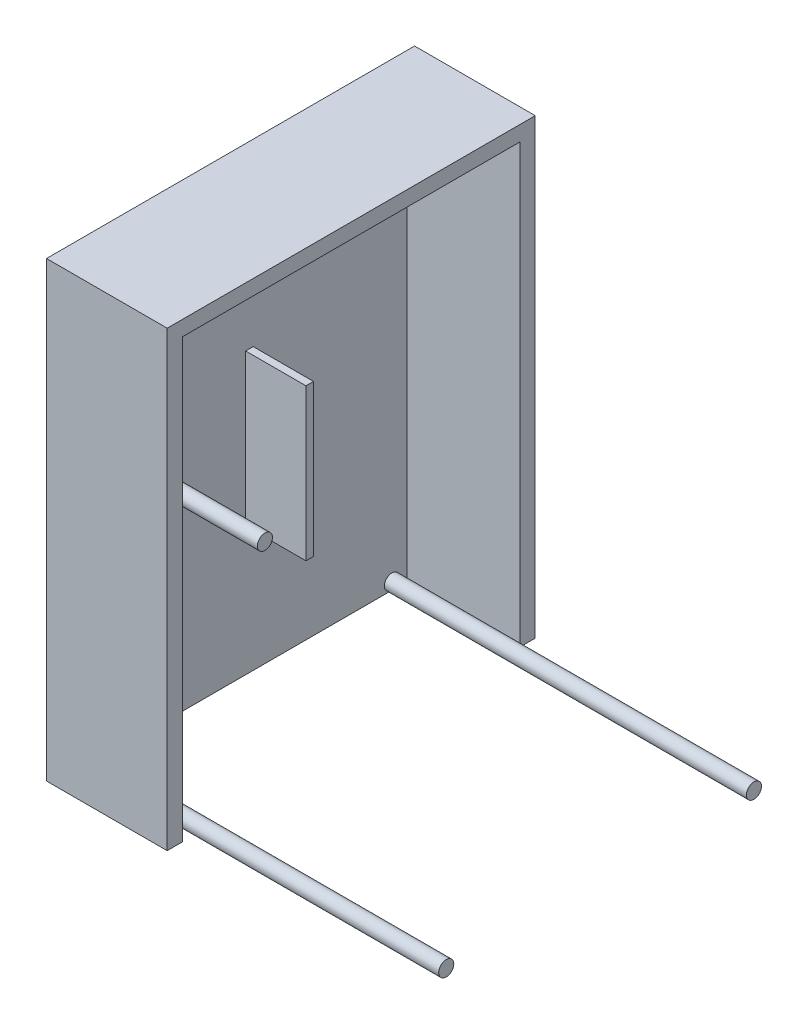
ISO-10303-21;
HEADER;
FILE_DESCRIPTION(('STEP AP214'),'2;1');
FILE_NAME('part.step','',(''),(''),'','','');
FILE_SCHEMA(('AUTOMOTIVE_DESIGN { 1 0 10303 214 1 1 1 1 }'));
ENDSEC;
DATA;
#1=APPLICATION_CONTEXT('core data for automotive mechanical design processes');
#2=APPLICATION_PROTOCOL_DEFINITION('international standard','automotive_design',2000,#1);
#3=PRODUCT_CONTEXT('',#1,'mechanical');
#4=PRODUCT('Part','Part','',(#3));
#5=PRODUCT_RELATED_PRODUCT_CATEGORY('part','',(#4));
#6=PRODUCT_DEFINITION_FORMATION('','',#4);
#7=PRODUCT_DEFINITION_CONTEXT('part definition',#1,'design');
#8=PRODUCT_DEFINITION('design','',#6,#7);
#9=PRODUCT_DEFINITION_SHAPE('','',#8);
#10=(LENGTH_UNIT() NAMED_UNIT(*) SI_UNIT(.MILLI.,.METRE.));
#11=(NAMED_UNIT(*) PLANE_ANGLE_UNIT() SI_UNIT($,.RADIAN.));
#12=(NAMED_UNIT(*) SI_UNIT($,.STERADIAN.) SOLID_ANGLE_UNIT());
#13=UNCERTAINTY_MEASURE_WITH_UNIT(LENGTH_MEASURE(1.E-05),#10,'distance_accuracy_value','');
#14=(GEOMETRIC_REPRESENTATION_CONTEXT(3) GLOBAL_UNCERTAINTY_ASSIGNED_CONTEXT((#13)) GLOBAL_UNIT_ASSIGNED_CONTEXT((#10,
#11,#12)) REPRESENTATION_CONTEXT('',''));
#15=CARTESIAN_POINT('',(0.,0.,0.));
#16=DIRECTION('',(0.,0.,1.));
#17=DIRECTION('',(1.,0.,0.));
#18=AXIS2_PLACEMENT_3D('',#15,#16,#17);
#19=CARTESIAN_POINT('',(3.175,0.,0.));
#20=DIRECTION('',(1.,0.,0.));
#21=DIRECTION('',(0.,0.,-1.));
#22=AXIS2_PLACEMENT_3D('',#19,#20,#21);
#23=PLANE('',#22);
#24=CARTESIAN_POINT('',(3.175,-4.63519323671498,36.8452755845411));
#25=DIRECTION('',(1.,0.,0.));
#26=DIRECTION('',(0.,0.,-1.));
#27=AXIS2_PLACEMENT_3D('',#24,#25,#26);
#28=CIRCLE('',#27,3.175);
#29=CARTESIAN_POINT('',(3.175,-4.63519323671498,33.6702755845411));
#30=VERTEX_POINT('',#29);
#31=EDGE_CURVE('E154',#30,#30,#28,.T.);
#32=ORIENTED_EDGE('',*,*,#31,.F.);
#33=EDGE_LOOP('',(#32));
#34=FACE_BOUND('',#33,.T.);
#35=DIRECTION('',(0.,0.,-1.));
#36=VECTOR('',#35,1.);
#37=CARTESIAN_POINT('',(3.175,-96.710193236715,0.));
#38=LINE('',#37,#36);
#39=CARTESIAN_POINT('',(3.17500000000001,-96.710193236715,65.2914975845411));
#40=VERTEX_POINT('',#39);
#41=CARTESIAN_POINT('',(3.17500000000001,-96.710193236715,-64.2485024154589));
#42=VERTEX_POINT('',#41);
#43=EDGE_CURVE('E42',#40,#42,#38,.T.);
#44=ORIENTED_EDGE('',*,*,#43,.T.);
#45=CARTESIAN_POINT('',(3.175,-93.535193236715,-64.2485024154589));
#46=DIRECTION('',(1.,0.,0.));
#47=DIRECTION('',(0.,0.,-1.));
#48=AXIS2_PLACEMENT_3D('',#45,#46,#47);
#49=CIRCLE('',#48,3.175);
#50=EDGE_CURVE('E56',#42,#42,#49,.T.);
#51=ORIENTED_EDGE('',*,*,#50,.F.);
#52=CARTESIAN_POINT('',(3.175,-96.710193236715,-70.5985024154589));
#53=VERTEX_POINT('',#52);
#54=EDGE_CURVE('E43',#42,#53,#38,.T.);
#55=ORIENTED_EDGE('',*,*,#54,.T.);
#56=DIRECTION('',(0.,-1.,0.));
#57=VECTOR('',#56,1.);
#58=CARTESIAN_POINT('',(3.175,0.,-70.5985024154589));
#59=LINE('',#58,#57);
#60=CARTESIAN_POINT('',(3.175,87.439806763285,-70.5985024154589));
#61=VERTEX_POINT('',#60);
#62=EDGE_CURVE('E227',#61,#53,#59,.T.);
#63=ORIENTED_EDGE('',*,*,#62,.F.);
#64=DIRECTION('',(0.,0.,-1.));
#65=VECTOR('',#64,1.);
#66=CARTESIAN_POINT('',(3.175,87.439806763285,0.));
#67=LINE('',#66,#65);
#68=CARTESIAN_POINT('',(3.175,87.439806763285,71.641497584541));
#69=VERTEX_POINT('',#68);
#70=EDGE_CURVE('E230',#69,#61,#67,.T.);
#71=ORIENTED_EDGE('',*,*,#70,.F.);
#72=DIRECTION('',(0.,-1.,0.));
#73=VECTOR('',#72,1.);
#74=CARTESIAN_POINT('',(3.175,0.,71.641497584541));
#75=LINE('',#74,#73);
#76=CARTESIAN_POINT('',(3.175,-96.710193236715,71.641497584541));
#77=VERTEX_POINT('',#76);
#78=EDGE_CURVE('E232',#69,#77,#75,.T.);
#79=ORIENTED_EDGE('',*,*,#78,.T.);
#80=EDGE_CURVE('E11',#77,#40,#38,.T.);
#81=ORIENTED_EDGE('',*,*,#80,.T.);
#82=CARTESIAN_POINT('',(3.175,-93.535193236715,65.2914975845411));
#83=DIRECTION('',(1.,0.,0.));
#84=DIRECTION('',(0.,0.,-1.));
#85=AXIS2_PLACEMENT_3D('',#82,#83,#84);
#86=CIRCLE('',#85,3.175);
#87=EDGE_CURVE('E167',#40,#40,#86,.T.);
#88=ORIENTED_EDGE('',*,*,#87,.F.);
#89=EDGE_LOOP('',(#44,#51,#55,#63,#71,#79,#81,#88));
#90=FACE_BOUND('',#89,.T.);
#91=DIRECTION('',(0.,0.,-1.));
#92=VECTOR('',#91,1.);
#93=CARTESIAN_POINT('',(3.175,-42.4596550093162,-2.65350241545894));
#94=LINE('',#93,#92);
#95=CARTESIAN_POINT('',(3.175,-42.4596550093162,-2.65350241545894));
#96=VERTEX_POINT('',#95);
#97=CARTESIAN_POINT('',(3.175,-42.4596550093162,-5.82850241545894));
#98=VERTEX_POINT('',#97);
#99=EDGE_CURVE('E459',#96,#98,#94,.T.);
#100=ORIENTED_EDGE('',*,*,#99,.F.);
#101=DIRECTION('',(0.,-1.,0.));
#102=VECTOR('',#101,1.);
#103=CARTESIAN_POINT('',(3.175,21.3483810599872,-2.65350241545893));
#104=LINE('',#103,#102);
#105=CARTESIAN_POINT('',(3.175,21.3483810599872,-2.65350241545893));
#106=VERTEX_POINT('',#105);
#107=EDGE_CURVE('E152',#106,#96,#104,.T.);
#108=ORIENTED_EDGE('',*,*,#107,.F.);
#109=DIRECTION('',(0.,0.,1.));
#110=VECTOR('',#109,1.);
#111=CARTESIAN_POINT('',(3.175,21.3483810599872,-2.65350241545893));
#112=LINE('',#111,#110);
#113=CARTESIAN_POINT('',(3.175,21.3483810599872,-5.82850241545893));
#114=VERTEX_POINT('',#113);
#115=EDGE_CURVE('E148',#114,#106,#112,.T.);
#116=ORIENTED_EDGE('',*,*,#115,.F.);
#117=DIRECTION('',(0.,1.,0.));
#118=VECTOR('',#117,1.);
#119=CARTESIAN_POINT('',(3.175,21.3483810599872,-5.82850241545893));
#120=LINE('',#119,#118);
#121=EDGE_CURVE('E456',#98,#114,#120,.T.);
#122=ORIENTED_EDGE('',*,*,#121,.F.);
#123=EDGE_LOOP('',(#100,#108,#116,#122));
#124=FACE_BOUND('',#123,.T.);
#125=ADVANCED_FACE('F33',(#34,#90,#124),#23,.T.);
#126=CARTESIAN_POINT('',(3.175,-96.710193236715,0.));
#127=DIRECTION('',(0.,1.,0.));
#128=DIRECTION('',(0.,0.,1.));
#129=AXIS2_PLACEMENT_3D('',#126,#127,#128);
#130=PLANE('',#129);
#131=DIRECTION('',(0.,0.,-1.));
#132=VECTOR('',#131,1.);
#133=CARTESIAN_POINT('',(0.,-96.710193236715,0.));
#134=LINE('',#133,#132);
#135=CARTESIAN_POINT('',(0.,-96.710193236715,77.991497584541));
#136=VERTEX_POINT('',#135);
#137=CARTESIAN_POINT('',(0.,-96.710193236715,-76.9485024154589));
#138=VERTEX_POINT('',#137);
#139=EDGE_CURVE('E37',#136,#138,#134,.T.);
#140=ORIENTED_EDGE('',*,*,#139,.T.);
#141=DIRECTION('',(-1.,0.,0.));
#142=VECTOR('',#141,1.);
#143=CARTESIAN_POINT('',(50.8,-96.710193236715,-76.9485024154589));
#144=LINE('',#143,#142);
#145=CARTESIAN_POINT('',(50.8,-96.710193236715,-76.9485024154589));
#146=VERTEX_POINT('',#145);
#147=EDGE_CURVE('E199',#146,#138,#144,.T.);
#148=ORIENTED_EDGE('',*,*,#147,.F.);
#149=DIRECTION('',(0.,0.,1.));
#150=VECTOR('',#149,1.);
#151=CARTESIAN_POINT('',(50.8,-96.710193236715,-76.9485024154589));
#152=LINE('',#151,#150);
#153=CARTESIAN_POINT('',(50.8,-96.710193236715,-70.5985024154589));
#154=VERTEX_POINT('',#153);
#155=EDGE_CURVE('E177',#146,#154,#152,.T.);
#156=ORIENTED_EDGE('',*,*,#155,.T.);
#157=DIRECTION('',(-1.,0.,0.));
#158=VECTOR('',#157,1.);
#159=CARTESIAN_POINT('',(50.8,-96.710193236715,-70.5985024154589));
#160=LINE('',#159,#158);
#161=EDGE_CURVE('E222',#154,#53,#160,.T.);
#162=ORIENTED_EDGE('',*,*,#161,.T.);
#163=ORIENTED_EDGE('',*,*,#54,.F.);
#164=ORIENTED_EDGE('',*,*,#43,.F.);
#165=ORIENTED_EDGE('',*,*,#80,.F.);
#166=DIRECTION('',(-1.,0.,0.));
#167=VECTOR('',#166,1.);
#168=CARTESIAN_POINT('',(50.8,-96.710193236715,71.641497584541));
#169=LINE('',#168,#167);
#170=CARTESIAN_POINT('',(50.8,-96.710193236715,71.641497584541));
#171=VERTEX_POINT('',#170);
#172=EDGE_CURVE('E214',#171,#77,#169,.T.);
#173=ORIENTED_EDGE('',*,*,#172,.F.);
#174=DIRECTION('',(0.,0.,1.));
#175=VECTOR('',#174,1.);
#176=CARTESIAN_POINT('',(50.8,-96.710193236715,71.641497584541));
#177=LINE('',#176,#175);
#178=CARTESIAN_POINT('',(50.8,-96.710193236715,77.991497584541));
#179=VERTEX_POINT('',#178);
#180=EDGE_CURVE('E190',#171,#179,#177,.T.);
#181=ORIENTED_EDGE('',*,*,#180,.T.);
#182=DIRECTION('',(-1.,0.,0.));
#183=VECTOR('',#182,1.);
#184=CARTESIAN_POINT('',(50.8,-96.710193236715,77.991497584541));
#185=LINE('',#184,#183);
#186=EDGE_CURVE('E211',#179,#136,#185,.T.);
#187=ORIENTED_EDGE('',*,*,#186,.T.);
#188=EDGE_LOOP('',(#140,#148,#156,#162,#163,#164,#165,#173,#181,#187));
#189=FACE_BOUND('',#188,.T.);
#190=ADVANCED_FACE('F35',(#189),#130,.F.);
#191=CARTESIAN_POINT('',(0.,0.,0.));
#192=DIRECTION('',(1.,0.,0.));
#193=DIRECTION('',(0.,0.,-1.));
#194=AXIS2_PLACEMENT_3D('',#191,#192,#193);
#195=PLANE('',#194);
#196=ORIENTED_EDGE('',*,*,#139,.F.);
#197=DIRECTION('',(0.,1.,0.));
#198=VECTOR('',#197,1.);
#199=CARTESIAN_POINT('',(0.,93.789806763285,77.991497584541));
#200=LINE('',#199,#198);
#201=CARTESIAN_POINT('',(0.,93.789806763285,77.991497584541));
#202=VERTEX_POINT('',#201);
#203=EDGE_CURVE('E202',#136,#202,#200,.T.);
#204=ORIENTED_EDGE('',*,*,#203,.T.);
#205=DIRECTION('',(0.,0.,-1.));
#206=VECTOR('',#205,1.);
#207=CARTESIAN_POINT('',(0.,93.789806763285,-76.9485024154589));
#208=LINE('',#207,#206);
#209=CARTESIAN_POINT('',(0.,93.789806763285,-76.9485024154589));
#210=VERTEX_POINT('',#209);
#211=EDGE_CURVE('E178',#202,#210,#208,.T.);
#212=ORIENTED_EDGE('',*,*,#211,.T.);
#213=DIRECTION('',(0.,-1.,0.));
#214=VECTOR('',#213,1.);
#215=CARTESIAN_POINT('',(0.,93.789806763285,-76.9485024154589));
#216=LINE('',#215,#214);
#217=EDGE_CURVE('E172',#210,#138,#216,.T.);
#218=ORIENTED_EDGE('',*,*,#217,.T.);
#219=EDGE_LOOP('',(#196,#204,#212,#218));
#220=FACE_BOUND('',#219,.T.);
#221=ADVANCED_FACE('F267',(#220),#195,.F.);
#222=CARTESIAN_POINT('',(50.8,93.789806763285,-76.9485024154589));
#223=DIRECTION('',(0.,0.,-1.));
#224=DIRECTION('',(-1.,0.,0.));
#225=AXIS2_PLACEMENT_3D('',#222,#223,#224);
#226=PLANE('',#225);
#227=ORIENTED_EDGE('',*,*,#217,.F.);
#228=DIRECTION('',(-1.,0.,0.));
#229=VECTOR('',#228,1.);
#230=CARTESIAN_POINT('',(50.8,93.789806763285,-76.9485024154589));
#231=LINE('',#230,#229);
#232=CARTESIAN_POINT('',(50.8,93.789806763285,-76.9485024154589));
#233=VERTEX_POINT('',#232);
#234=EDGE_CURVE('E207',#233,#210,#231,.T.);
#235=ORIENTED_EDGE('',*,*,#234,.F.);
#236=DIRECTION('',(0.,-1.,0.));
#237=VECTOR('',#236,1.);
#238=CARTESIAN_POINT('',(50.8,93.789806763285,-76.9485024154589));
#239=LINE('',#238,#237);
#240=EDGE_CURVE('E174',#233,#146,#239,.T.);
#241=ORIENTED_EDGE('',*,*,#240,.T.);
#242=ORIENTED_EDGE('',*,*,#147,.T.);
#243=EDGE_LOOP('',(#227,#235,#241,#242));
#244=FACE_BOUND('',#243,.T.);
#245=ADVANCED_FACE('F266',(#244),#226,.T.);
#246=CARTESIAN_POINT('',(50.8,93.789806763285,-76.9485024154589));
#247=DIRECTION('',(0.,1.,0.));
#248=DIRECTION('',(0.,0.,1.));
#249=AXIS2_PLACEMENT_3D('',#246,#247,#248);
#250=PLANE('',#249);
#251=ORIENTED_EDGE('',*,*,#211,.F.);
#252=DIRECTION('',(-1.,0.,0.));
#253=VECTOR('',#252,1.);
#254=CARTESIAN_POINT('',(50.8,93.789806763285,77.991497584541));
#255=LINE('',#254,#253);
#256=CARTESIAN_POINT('',(50.8,93.789806763285,77.991497584541));
#257=VERTEX_POINT('',#256);
#258=EDGE_CURVE('E209',#257,#202,#255,.T.);
#259=ORIENTED_EDGE('',*,*,#258,.F.);
#260=DIRECTION('',(0.,0.,-1.));
#261=VECTOR('',#260,1.);
#262=CARTESIAN_POINT('',(50.8,93.789806763285,-76.9485024154589));
#263=LINE('',#262,#261);
#264=EDGE_CURVE('E196',#257,#233,#263,.T.);
#265=ORIENTED_EDGE('',*,*,#264,.T.);
#266=ORIENTED_EDGE('',*,*,#234,.T.);
#267=EDGE_LOOP('',(#251,#259,#265,#266));
#268=FACE_BOUND('',#267,.T.);
#269=ADVANCED_FACE('F270',(#268),#250,.T.);
#270=CARTESIAN_POINT('',(50.8,93.789806763285,77.991497584541));
#271=DIRECTION('',(0.,0.,1.));
#272=DIRECTION('',(1.,0.,0.));
#273=AXIS2_PLACEMENT_3D('',#270,#271,#272);
#274=PLANE('',#273);
#275=ORIENTED_EDGE('',*,*,#203,.F.);
#276=ORIENTED_EDGE('',*,*,#186,.F.);
#277=DIRECTION('',(0.,1.,0.));
#278=VECTOR('',#277,1.);
#279=CARTESIAN_POINT('',(50.8,93.789806763285,77.991497584541));
#280=LINE('',#279,#278);
#281=EDGE_CURVE('E193',#179,#257,#280,.T.);
#282=ORIENTED_EDGE('',*,*,#281,.T.);
#283=ORIENTED_EDGE('',*,*,#258,.T.);
#284=EDGE_LOOP('',(#275,#276,#282,#283));
#285=FACE_BOUND('',#284,.T.);
#286=ADVANCED_FACE('F262',(#285),#274,.T.);
#287=CARTESIAN_POINT('',(50.8,87.439806763285,71.641497584541));
#288=DIRECTION('',(0.,0.,-1.));
#289=DIRECTION('',(-1.,0.,0.));
#290=AXIS2_PLACEMENT_3D('',#287,#288,#289);
#291=PLANE('',#290);
#292=ORIENTED_EDGE('',*,*,#172,.T.);
#293=ORIENTED_EDGE('',*,*,#78,.F.);
#294=DIRECTION('',(-1.,0.,0.));
#295=VECTOR('',#294,1.);
#296=CARTESIAN_POINT('',(50.8,87.439806763285,71.641497584541));
#297=LINE('',#296,#295);
#298=CARTESIAN_POINT('',(50.8,87.439806763285,71.641497584541));
#299=VERTEX_POINT('',#298);
#300=EDGE_CURVE('E216',#299,#69,#297,.T.);
#301=ORIENTED_EDGE('',*,*,#300,.F.);
#302=DIRECTION('',(0.,-1.,0.));
#303=VECTOR('',#302,1.);
#304=CARTESIAN_POINT('',(50.8,87.439806763285,71.641497584541));
#305=LINE('',#304,#303);
#306=EDGE_CURVE('E187',#299,#171,#305,.T.);
#307=ORIENTED_EDGE('',*,*,#306,.T.);
#308=EDGE_LOOP('',(#292,#293,#301,#307));
#309=FACE_BOUND('',#308,.T.);
#310=ADVANCED_FACE('F257',(#309),#291,.T.);
#311=CARTESIAN_POINT('',(50.8,87.439806763285,-70.5985024154589));
#312=DIRECTION('',(0.,-1.,0.));
#313=DIRECTION('',(0.,0.,-1.));
#314=AXIS2_PLACEMENT_3D('',#311,#312,#313);
#315=PLANE('',#314);
#316=ORIENTED_EDGE('',*,*,#300,.T.);
#317=ORIENTED_EDGE('',*,*,#70,.T.);
#318=DIRECTION('',(-1.,0.,0.));
#319=VECTOR('',#318,1.);
#320=CARTESIAN_POINT('',(50.8,87.439806763285,-70.5985024154589));
#321=LINE('',#320,#319);
#322=CARTESIAN_POINT('',(50.8,87.439806763285,-70.5985024154589));
#323=VERTEX_POINT('',#322);
#324=EDGE_CURVE('E219',#323,#61,#321,.T.);
#325=ORIENTED_EDGE('',*,*,#324,.F.);
#326=DIRECTION('',(0.,0.,1.));
#327=VECTOR('',#326,1.);
#328=CARTESIAN_POINT('',(50.8,87.439806763285,-70.5985024154589));
#329=LINE('',#328,#327);
#330=EDGE_CURVE('E184',#323,#299,#329,.T.);
#331=ORIENTED_EDGE('',*,*,#330,.T.);
#332=EDGE_LOOP('',(#316,#317,#325,#331));
#333=FACE_BOUND('',#332,.T.);
#334=ADVANCED_FACE('F255',(#333),#315,.T.);
#335=CARTESIAN_POINT('',(50.8,87.439806763285,-70.5985024154589));
#336=DIRECTION('',(0.,0.,1.));
#337=DIRECTION('',(1.,0.,0.));
#338=AXIS2_PLACEMENT_3D('',#335,#336,#337);
#339=PLANE('',#338);
#340=ORIENTED_EDGE('',*,*,#324,.T.);
#341=ORIENTED_EDGE('',*,*,#62,.T.);
#342=ORIENTED_EDGE('',*,*,#161,.F.);
#343=DIRECTION('',(0.,1.,0.));
#344=VECTOR('',#343,1.);
#345=CARTESIAN_POINT('',(50.8,87.439806763285,-70.5985024154589));
#346=LINE('',#345,#344);
#347=EDGE_CURVE('E181',#154,#323,#346,.T.);
#348=ORIENTED_EDGE('',*,*,#347,.T.);
#349=EDGE_LOOP('',(#340,#341,#342,#348));
#350=FACE_BOUND('',#349,.T.);
#351=ADVANCED_FACE('F247',(#350),#339,.T.);
#352=CARTESIAN_POINT('',(50.8,0.,0.));
#353=DIRECTION('',(-1.,0.,0.));
#354=DIRECTION('',(0.,0.,1.));
#355=AXIS2_PLACEMENT_3D('',#352,#353,#354);
#356=PLANE('',#355);
#357=ORIENTED_EDGE('',*,*,#240,.F.);
#358=ORIENTED_EDGE('',*,*,#264,.F.);
#359=ORIENTED_EDGE('',*,*,#281,.F.);
#360=ORIENTED_EDGE('',*,*,#180,.F.);
#361=ORIENTED_EDGE('',*,*,#306,.F.);
#362=ORIENTED_EDGE('',*,*,#330,.F.);
#363=ORIENTED_EDGE('',*,*,#347,.F.);
#364=ORIENTED_EDGE('',*,*,#155,.F.);
#365=EDGE_LOOP('',(#357,#358,#359,#360,#361,#362,#363,#364));
#366=FACE_BOUND('',#365,.T.);
#367=ADVANCED_FACE('F251',(#366),#356,.F.);
#368=CARTESIAN_POINT('',(155.575,-93.535193236715,65.2914975845411));
#369=DIRECTION('',(-1.,0.,0.));
#370=DIRECTION('',(0.,0.,1.));
#371=AXIS2_PLACEMENT_3D('',#368,#369,#370);
#372=CYLINDRICAL_SURFACE('',#371,3.175);
#373=CARTESIAN_POINT('',(155.575,-93.535193236715,65.2914975845411));
#374=DIRECTION('',(1.,0.,0.));
#375=DIRECTION('',(0.,0.,-1.));
#376=AXIS2_PLACEMENT_3D('',#373,#374,#375);
#377=CIRCLE('',#376,3.175);
#378=CARTESIAN_POINT('',(155.575,-93.535193236715,62.1164975845411));
#379=VERTEX_POINT('',#378);
#380=EDGE_CURVE('E169',#379,#379,#377,.T.);
#381=ORIENTED_EDGE('',*,*,#380,.F.);
#382=EDGE_LOOP('',(#381));
#383=FACE_BOUND('',#382,.T.);
#384=ORIENTED_EDGE('',*,*,#87,.T.);
#385=EDGE_LOOP('',(#384));
#386=FACE_BOUND('',#385,.T.);
#387=ADVANCED_FACE('F338',(#383,#386),#372,.T.);
#388=CARTESIAN_POINT('',(155.575,-93.535193236715,65.2914975845411));
#389=DIRECTION('',(1.,0.,0.));
#390=DIRECTION('',(0.,0.,-1.));
#391=AXIS2_PLACEMENT_3D('',#388,#389,#390);
#392=PLANE('',#391);
#393=ORIENTED_EDGE('',*,*,#380,.T.);
#394=EDGE_LOOP('',(#393));
#395=FACE_BOUND('',#394,.T.);
#396=ADVANCED_FACE('F352',(#395),#392,.T.);
#397=CARTESIAN_POINT('',(155.575,-93.535193236715,-64.2485024154589));
#398=DIRECTION('',(-1.,0.,0.));
#399=DIRECTION('',(0.,0.,1.));
#400=AXIS2_PLACEMENT_3D('',#397,#398,#399);
#401=CYLINDRICAL_SURFACE('',#400,3.175);
#402=CARTESIAN_POINT('',(155.575,-93.535193236715,-64.2485024154589));
#403=DIRECTION('',(1.,0.,0.));
#404=DIRECTION('',(0.,0.,-1.));
#405=AXIS2_PLACEMENT_3D('',#402,#403,#404);
#406=CIRCLE('',#405,3.175);
#407=CARTESIAN_POINT('',(155.575,-93.535193236715,-67.4235024154589));
#408=VERTEX_POINT('',#407);
#409=EDGE_CURVE('E164',#408,#408,#406,.T.);
#410=ORIENTED_EDGE('',*,*,#409,.F.);
#411=EDGE_LOOP('',(#410));
#412=FACE_BOUND('',#411,.T.);
#413=ORIENTED_EDGE('',*,*,#50,.T.);
#414=EDGE_LOOP('',(#413));
#415=FACE_BOUND('',#414,.T.);
#416=ADVANCED_FACE('F362',(#412,#415),#401,.T.);
#417=CARTESIAN_POINT('',(155.575,-93.535193236715,-64.2485024154589));
#418=DIRECTION('',(1.,0.,0.));
#419=DIRECTION('',(0.,0.,-1.));
#420=AXIS2_PLACEMENT_3D('',#417,#418,#419);
#421=PLANE('',#420);
#422=ORIENTED_EDGE('',*,*,#409,.T.);
#423=EDGE_LOOP('',(#422));
#424=FACE_BOUND('',#423,.T.);
#425=ADVANCED_FACE('F372',(#424),#421,.T.);
#426=CARTESIAN_POINT('',(50.8,-4.63519323671498,36.8452755845411));
#427=DIRECTION('',(-1.,0.,0.));
#428=DIRECTION('',(0.,0.,1.));
#429=AXIS2_PLACEMENT_3D('',#426,#427,#428);
#430=CYLINDRICAL_SURFACE('',#429,3.175);
#431=CARTESIAN_POINT('',(50.8,-4.63519323671498,36.8452755845411));
#432=DIRECTION('',(1.,0.,0.));
#433=DIRECTION('',(0.,0.,-1.));
#434=AXIS2_PLACEMENT_3D('',#431,#432,#433);
#435=CIRCLE('',#434,3.175);
#436=CARTESIAN_POINT('',(50.8,-4.63519323671498,33.6702755845411));
#437=VERTEX_POINT('',#436);
#438=EDGE_CURVE('E157',#437,#437,#435,.T.);
#439=ORIENTED_EDGE('',*,*,#438,.F.);
#440=EDGE_LOOP('',(#439));
#441=FACE_BOUND('',#440,.T.);
#442=ORIENTED_EDGE('',*,*,#31,.T.);
#443=EDGE_LOOP('',(#442));
#444=FACE_BOUND('',#443,.T.);
#445=ADVANCED_FACE('F382',(#441,#444),#430,.T.);
#446=CARTESIAN_POINT('',(50.8,-4.63519323671498,36.8452755845411));
#447=DIRECTION('',(1.,0.,0.));
#448=DIRECTION('',(0.,0.,-1.));
#449=AXIS2_PLACEMENT_3D('',#446,#447,#448);
#450=PLANE('',#449);
#451=ORIENTED_EDGE('',*,*,#438,.T.);
#452=EDGE_LOOP('',(#451));
#453=FACE_BOUND('',#452,.T.);
#454=ADVANCED_FACE('F392',(#453),#450,.T.);
#455=CARTESIAN_POINT('',(28.575,21.3483810599872,-2.65350241545893));
#456=DIRECTION('',(0.,0.,-1.));
#457=DIRECTION('',(0.,1.,0.));
#458=AXIS2_PLACEMENT_3D('',#455,#456,#457);
#459=PLANE('',#458);
#460=ORIENTED_EDGE('',*,*,#107,.T.);
#461=DIRECTION('',(-1.,0.,0.));
#462=VECTOR('',#461,1.);
#463=CARTESIAN_POINT('',(28.575,-42.4596550093162,-2.65350241545894));
#464=LINE('',#463,#462);
#465=CARTESIAN_POINT('',(28.575,-42.4596550093162,-2.65350241545894));
#466=VERTEX_POINT('',#465);
#467=EDGE_CURVE('E133',#466,#96,#464,.T.);
#468=ORIENTED_EDGE('',*,*,#467,.F.);
#469=DIRECTION('',(0.,-1.,0.));
#470=VECTOR('',#469,1.);
#471=CARTESIAN_POINT('',(28.575,21.3483810599872,-2.65350241545893));
#472=LINE('',#471,#470);
#473=CARTESIAN_POINT('',(28.575,21.3483810599872,-2.65350241545893));
#474=VERTEX_POINT('',#473);
#475=EDGE_CURVE('E140',#474,#466,#472,.T.);
#476=ORIENTED_EDGE('',*,*,#475,.F.);
#477=DIRECTION('',(-1.,0.,0.));
#478=VECTOR('',#477,1.);
#479=CARTESIAN_POINT('',(28.575,21.3483810599872,-2.65350241545893));
#480=LINE('',#479,#478);
#481=EDGE_CURVE('E454',#474,#106,#480,.T.);
#482=ORIENTED_EDGE('',*,*,#481,.T.);
#483=EDGE_LOOP('',(#460,#468,#476,#482));
#484=FACE_BOUND('',#483,.T.);
#485=ADVANCED_FACE('F150',(#484),#459,.F.);
#486=CARTESIAN_POINT('',(28.575,-42.4596550093162,-2.65350241545894));
#487=DIRECTION('',(0.,1.,0.));
#488=DIRECTION('',(0.,0.,1.));
#489=AXIS2_PLACEMENT_3D('',#486,#487,#488);
#490=PLANE('',#489);
#491=ORIENTED_EDGE('',*,*,#99,.T.);
#492=DIRECTION('',(-1.,0.,0.));
#493=VECTOR('',#492,1.);
#494=CARTESIAN_POINT('',(28.575,-42.4596550093162,-5.82850241545894));
#495=LINE('',#494,#493);
#496=CARTESIAN_POINT('',(28.575,-42.4596550093162,-5.82850241545894));
#497=VERTEX_POINT('',#496);
#498=EDGE_CURVE('E136',#497,#98,#495,.T.);
#499=ORIENTED_EDGE('',*,*,#498,.F.);
#500=DIRECTION('',(0.,0.,-1.));
#501=VECTOR('',#500,1.);
#502=CARTESIAN_POINT('',(28.575,-42.4596550093162,-2.65350241545894));
#503=LINE('',#502,#501);
#504=EDGE_CURVE('E129',#466,#497,#503,.T.);
#505=ORIENTED_EDGE('',*,*,#504,.F.);
#506=ORIENTED_EDGE('',*,*,#467,.T.);
#507=EDGE_LOOP('',(#491,#499,#505,#506));
#508=FACE_BOUND('',#507,.T.);
#509=ADVANCED_FACE('F131',(#508),#490,.F.);
#510=CARTESIAN_POINT('',(28.575,21.3483810599872,-5.82850241545893));
#511=DIRECTION('',(0.,0.,1.));
#512=DIRECTION('',(0.,-1.,0.));
#513=AXIS2_PLACEMENT_3D('',#510,#511,#512);
#514=PLANE('',#513);
#515=ORIENTED_EDGE('',*,*,#121,.T.);
#516=DIRECTION('',(-1.,0.,0.));
#517=VECTOR('',#516,1.);
#518=CARTESIAN_POINT('',(28.575,21.3483810599872,-5.82850241545893));
#519=LINE('',#518,#517);
#520=CARTESIAN_POINT('',(28.575,21.3483810599872,-5.82850241545893));
#521=VERTEX_POINT('',#520);
#522=EDGE_CURVE('E50',#521,#114,#519,.T.);
#523=ORIENTED_EDGE('',*,*,#522,.F.);
#524=DIRECTION('',(0.,1.,0.));
#525=VECTOR('',#524,1.);
#526=CARTESIAN_POINT('',(28.575,21.3483810599872,-5.82850241545893));
#527=LINE('',#526,#525);
#528=EDGE_CURVE('E139',#497,#521,#527,.T.);
#529=ORIENTED_EDGE('',*,*,#528,.F.);
#530=ORIENTED_EDGE('',*,*,#498,.T.);
#531=EDGE_LOOP('',(#515,#523,#529,#530));
#532=FACE_BOUND('',#531,.T.);
#533=ADVANCED_FACE('F423',(#532),#514,.F.);
#534=CARTESIAN_POINT('',(28.575,21.3483810599872,-2.65350241545893));
#535=DIRECTION('',(0.,-1.,0.));
#536=DIRECTION('',(0.,0.,-1.));
#537=AXIS2_PLACEMENT_3D('',#534,#535,#536);
#538=PLANE('',#537);
#539=ORIENTED_EDGE('',*,*,#115,.T.);
#540=ORIENTED_EDGE('',*,*,#481,.F.);
#541=DIRECTION('',(0.,0.,1.));
#542=VECTOR('',#541,1.);
#543=CARTESIAN_POINT('',(28.575,21.3483810599872,-2.65350241545893));
#544=LINE('',#543,#542);
#545=EDGE_CURVE('E144',#521,#474,#544,.T.);
#546=ORIENTED_EDGE('',*,*,#545,.F.);
#547=ORIENTED_EDGE('',*,*,#522,.T.);
#548=EDGE_LOOP('',(#539,#540,#546,#547));
#549=FACE_BOUND('',#548,.T.);
#550=ADVANCED_FACE('F432',(#549),#538,.F.);
#551=CARTESIAN_POINT('',(28.575,0.,0.));
#552=DIRECTION('',(1.,0.,0.));
#553=DIRECTION('',(0.,0.,-1.));
#554=AXIS2_PLACEMENT_3D('',#551,#552,#553);
#555=PLANE('',#554);
#556=ORIENTED_EDGE('',*,*,#475,.T.);
#557=ORIENTED_EDGE('',*,*,#504,.T.);
#558=ORIENTED_EDGE('',*,*,#528,.T.);
#559=ORIENTED_EDGE('',*,*,#545,.T.);
#560=EDGE_LOOP('',(#556,#557,#558,#559));
#561=FACE_BOUND('',#560,.T.);
#562=ADVANCED_FACE('F143',(#561),#555,.T.);
#563=CLOSED_SHELL('',(#125,#190,#221,#245,#269,#286,#310,#334,#351,#367,#387,#396,#416,#425,
#445,#454,#485,#509,#533,#550,#562));
#564=MANIFOLD_SOLID_BREP('B2',#563);
#565=ADVANCED_BREP_SHAPE_REPRESENTATION('',(#18,#564),#14);
#566=SHAPE_DEFINITION_REPRESENTATION(#9,#565);
ENDSEC;
END-ISO-10303-21;
